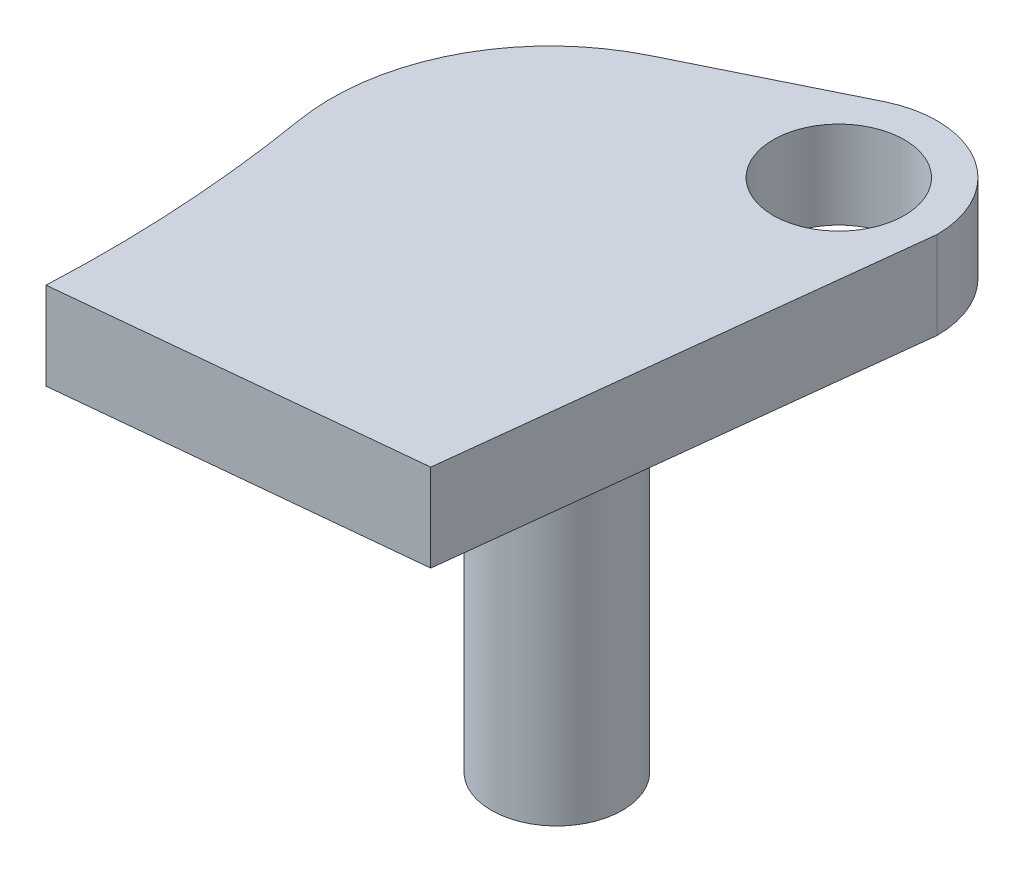
ISO-10303-21;
HEADER;
FILE_DESCRIPTION(('STEP AP214'),'2;1');
FILE_NAME('part.step','',(''),(''),'','','');
FILE_SCHEMA(('AUTOMOTIVE_DESIGN { 1 0 10303 214 1 1 1 1 }'));
ENDSEC;
DATA;
#1=APPLICATION_CONTEXT('core data for automotive mechanical design processes');
#2=APPLICATION_PROTOCOL_DEFINITION('international standard','automotive_design',2000,#1);
#3=PRODUCT_CONTEXT('',#1,'mechanical');
#4=PRODUCT('Part','Part','',(#3));
#5=PRODUCT_RELATED_PRODUCT_CATEGORY('part','',(#4));
#6=PRODUCT_DEFINITION_FORMATION('','',#4);
#7=PRODUCT_DEFINITION_CONTEXT('part definition',#1,'design');
#8=PRODUCT_DEFINITION('design','',#6,#7);
#9=PRODUCT_DEFINITION_SHAPE('','',#8);
#10=(LENGTH_UNIT() NAMED_UNIT(*) SI_UNIT(.MILLI.,.METRE.));
#11=(NAMED_UNIT(*) PLANE_ANGLE_UNIT() SI_UNIT($,.RADIAN.));
#12=(NAMED_UNIT(*) SI_UNIT($,.STERADIAN.) SOLID_ANGLE_UNIT());
#13=UNCERTAINTY_MEASURE_WITH_UNIT(LENGTH_MEASURE(1.E-05),#10,'distance_accuracy_value','');
#14=(GEOMETRIC_REPRESENTATION_CONTEXT(3) GLOBAL_UNCERTAINTY_ASSIGNED_CONTEXT((#13)) GLOBAL_UNIT_ASSIGNED_CONTEXT((#10,
#11,#12)) REPRESENTATION_CONTEXT('',''));
#15=CARTESIAN_POINT('',(0.,0.,0.));
#16=DIRECTION('',(0.,0.,1.));
#17=DIRECTION('',(1.,0.,0.));
#18=AXIS2_PLACEMENT_3D('',#15,#16,#17);
#19=CARTESIAN_POINT('',(-24.9679527722651,2.,-6.01005480013258));
#20=DIRECTION('',(0.,-1.,0.));
#21=DIRECTION('',(0.,0.,-1.));
#22=AXIS2_PLACEMENT_3D('',#19,#20,#21);
#23=CYLINDRICAL_SURFACE('',#22,28.9991720423323);
#24=CARTESIAN_POINT('',(-24.9679527722651,2.,-6.01005480013258));
#25=DIRECTION('',(0.,1.,0.));
#26=DIRECTION('',(0.,0.,1.));
#27=AXIS2_PLACEMENT_3D('',#24,#25,#26);
#28=CIRCLE('',#27,28.9991720423323);
#29=CARTESIAN_POINT('',(4.00038120431635,2.,-4.67304105224966));
#30=VERTEX_POINT('',#29);
#31=CARTESIAN_POINT('',(3.63152206259976,2.,-10.8081813418906));
#32=VERTEX_POINT('',#31);
#33=EDGE_CURVE('E94',#30,#32,#28,.T.);
#34=ORIENTED_EDGE('',*,*,#33,.T.);
#35=DIRECTION('',(0.,-1.,0.));
#36=VECTOR('',#35,1.);
#37=CARTESIAN_POINT('',(3.63152206259976,2.,-10.8081813418906));
#38=LINE('',#37,#36);
#39=CARTESIAN_POINT('',(3.63152206259976,0.,-10.8081813418906));
#40=VERTEX_POINT('',#39);
#41=EDGE_CURVE('E101',#32,#40,#38,.T.);
#42=ORIENTED_EDGE('',*,*,#41,.T.);
#43=CARTESIAN_POINT('',(-24.9679527722651,0.,-6.01005480013258));
#44=DIRECTION('',(0.,1.,0.));
#45=DIRECTION('',(0.,0.,1.));
#46=AXIS2_PLACEMENT_3D('',#43,#44,#45);
#47=CIRCLE('',#46,28.9991720423323);
#48=CARTESIAN_POINT('',(4.00038120431635,0.,-4.67304105224966));
#49=VERTEX_POINT('',#48);
#50=EDGE_CURVE('E96',#49,#40,#47,.T.);
#51=ORIENTED_EDGE('',*,*,#50,.F.);
#52=DIRECTION('',(0.,-1.,0.));
#53=VECTOR('',#52,1.);
#54=CARTESIAN_POINT('',(4.00038120431635,2.,-4.67304105224966));
#55=LINE('',#54,#53);
#56=EDGE_CURVE('E91',#30,#49,#55,.T.);
#57=ORIENTED_EDGE('',*,*,#56,.F.);
#58=EDGE_LOOP('',(#34,#42,#51,#57));
#59=FACE_BOUND('',#58,.T.);
#60=ADVANCED_FACE('F38',(#59),#23,.F.);
#61=CARTESIAN_POINT('',(-0.420916720163327,2.,-4.23344697376737));
#62=DIRECTION('',(0.0989386449958702,0.,0.995093535566572));
#63=DIRECTION('',(0.995093535566572,0.,-0.0989386449958702));
#64=AXIS2_PLACEMENT_3D('',#61,#62,#63);
#65=PLANE('',#64);
#66=DIRECTION('',(-0.995093535566572,0.,0.0989386449958702));
#67=VECTOR('',#66,1.);
#68=CARTESIAN_POINT('',(-0.420916720163327,0.,-4.23344697376737));
#69=LINE('',#68,#67);
#70=CARTESIAN_POINT('',(12.0003812043163,0.,-5.46845287202025));
#71=VERTEX_POINT('',#70);
#72=EDGE_CURVE('E128',#71,#49,#69,.T.);
#73=ORIENTED_EDGE('',*,*,#72,.F.);
#74=DIRECTION('',(0.,-1.,0.));
#75=VECTOR('',#74,1.);
#76=CARTESIAN_POINT('',(12.0003812043163,2.,-5.46845287202025));
#77=LINE('',#76,#75);
#78=CARTESIAN_POINT('',(12.0003812043163,2.,-5.46845287202025));
#79=VERTEX_POINT('',#78);
#80=EDGE_CURVE('E102',#79,#71,#77,.T.);
#81=ORIENTED_EDGE('',*,*,#80,.F.);
#82=DIRECTION('',(-0.995093535566572,0.,0.0989386449958702));
#83=VECTOR('',#82,1.);
#84=CARTESIAN_POINT('',(-0.420916720163327,2.,-4.23344697376737));
#85=LINE('',#84,#83);
#86=EDGE_CURVE('E108',#79,#30,#85,.T.);
#87=ORIENTED_EDGE('',*,*,#86,.T.);
#88=ORIENTED_EDGE('',*,*,#56,.T.);
#89=EDGE_LOOP('',(#73,#81,#87,#88));
#90=FACE_BOUND('',#89,.T.);
#91=ADVANCED_FACE('F112',(#90),#65,.T.);
#92=CARTESIAN_POINT('',(11.2330122571857,2.,1.27773804442567));
#93=DIRECTION('',(-0.993592751476446,0.,-0.113019662950595));
#94=DIRECTION('',(-0.113019662950595,0.,0.993592751476446));
#95=AXIS2_PLACEMENT_3D('',#92,#93,#94);
#96=PLANE('',#95);
#97=DIRECTION('',(0.113019662950595,0.,-0.993592751476446));
#98=VECTOR('',#97,1.);
#99=CARTESIAN_POINT('',(11.2330122571857,0.,1.27773804442567));
#100=LINE('',#99,#98);
#101=CARTESIAN_POINT('',(13.1829386551336,0.,-15.864701459756));
#102=VERTEX_POINT('',#101);
#103=EDGE_CURVE('E131',#71,#102,#100,.T.);
#104=ORIENTED_EDGE('',*,*,#103,.T.);
#105=DIRECTION('',(0.,-1.,0.));
#106=VECTOR('',#105,1.);
#107=CARTESIAN_POINT('',(13.1829386551336,2.,-15.864701459756));
#108=LINE('',#107,#106);
#109=CARTESIAN_POINT('',(13.1829386551336,2.,-15.864701459756));
#110=VERTEX_POINT('',#109);
#111=EDGE_CURVE('E141',#110,#102,#108,.T.);
#112=ORIENTED_EDGE('',*,*,#111,.F.);
#113=DIRECTION('',(0.113019662950595,0.,-0.993592751476446));
#114=VECTOR('',#113,1.);
#115=CARTESIAN_POINT('',(11.2330122571857,2.,1.27773804442567));
#116=LINE('',#115,#114);
#117=EDGE_CURVE('E114',#79,#110,#116,.T.);
#118=ORIENTED_EDGE('',*,*,#117,.F.);
#119=ORIENTED_EDGE('',*,*,#80,.T.);
#120=EDGE_LOOP('',(#104,#112,#118,#119));
#121=FACE_BOUND('',#120,.T.);
#122=ADVANCED_FACE('F153',(#121),#96,.F.);
#123=CARTESIAN_POINT('',(10.9329386551336,2.,-15.864701459756));
#124=DIRECTION('',(0.,-1.,0.));
#125=DIRECTION('',(0.,0.,-1.));
#126=AXIS2_PLACEMENT_3D('',#123,#124,#125);
#127=CYLINDRICAL_SURFACE('',#126,2.25);
#128=CARTESIAN_POINT('',(10.9329386551336,0.,-15.864701459756));
#129=DIRECTION('',(0.,1.,0.));
#130=DIRECTION('',(0.,0.,1.));
#131=AXIS2_PLACEMENT_3D('',#128,#129,#130);
#132=CIRCLE('',#131,2.25);
#133=CARTESIAN_POINT('',(9.97879512350059,0.,-17.9023741815254));
#134=VERTEX_POINT('',#133);
#135=EDGE_CURVE('E133',#102,#134,#132,.T.);
#136=ORIENTED_EDGE('',*,*,#135,.T.);
#137=DIRECTION('',(0.,-1.,0.));
#138=VECTOR('',#137,1.);
#139=CARTESIAN_POINT('',(9.97879512350059,2.,-17.9023741815254));
#140=LINE('',#139,#138);
#141=CARTESIAN_POINT('',(9.97879512350059,2.,-17.9023741815254));
#142=VERTEX_POINT('',#141);
#143=EDGE_CURVE('E126',#142,#134,#140,.T.);
#144=ORIENTED_EDGE('',*,*,#143,.F.);
#145=CARTESIAN_POINT('',(10.9329386551336,2.,-15.864701459756));
#146=DIRECTION('',(0.,1.,0.));
#147=DIRECTION('',(0.,0.,1.));
#148=AXIS2_PLACEMENT_3D('',#145,#146,#147);
#149=CIRCLE('',#148,2.25);
#150=EDGE_CURVE('E116',#110,#142,#149,.T.);
#151=ORIENTED_EDGE('',*,*,#150,.F.);
#152=ORIENTED_EDGE('',*,*,#111,.T.);
#153=EDGE_LOOP('',(#136,#144,#151,#152));
#154=FACE_BOUND('',#153,.T.);
#155=ADVANCED_FACE('F156',(#154),#127,.T.);
#156=CARTESIAN_POINT('',(-5.14512535667179,2.,-10.470819802642));
#157=DIRECTION('',(0.441011925605157,0.,0.897501243160159));
#158=DIRECTION('',(0.897501243160159,0.,-0.441011925605157));
#159=AXIS2_PLACEMENT_3D('',#156,#157,#158);
#160=PLANE('',#159);
#161=DIRECTION('',(-0.897501243160159,0.,0.441011925605157));
#162=VECTOR('',#161,1.);
#163=CARTESIAN_POINT('',(-5.14512535667179,0.,-10.470819802642));
#164=LINE('',#163,#162);
#165=CARTESIAN_POINT('',(6.3575471553922,0.,-16.1229743738036));
#166=VERTEX_POINT('',#165);
#167=EDGE_CURVE('E135',#134,#166,#164,.T.);
#168=ORIENTED_EDGE('',*,*,#167,.T.);
#169=DIRECTION('',(0.,1.,0.));
#170=VECTOR('',#169,1.);
#171=CARTESIAN_POINT('',(6.3575471553922,2.,-16.1229743738036));
#172=LINE('',#171,#170);
#173=CARTESIAN_POINT('',(6.3575471553922,2.,-16.1229743738036));
#174=VERTEX_POINT('',#173);
#175=EDGE_CURVE('E46',#166,#174,#172,.T.);
#176=ORIENTED_EDGE('',*,*,#175,.T.);
#177=DIRECTION('',(-0.897501243160159,0.,0.441011925605157));
#178=VECTOR('',#177,1.);
#179=CARTESIAN_POINT('',(-5.14512535667179,2.,-10.470819802642));
#180=LINE('',#179,#178);
#181=EDGE_CURVE('E121',#142,#174,#180,.T.);
#182=ORIENTED_EDGE('',*,*,#181,.F.);
#183=ORIENTED_EDGE('',*,*,#143,.T.);
#184=EDGE_LOOP('',(#168,#176,#182,#183));
#185=FACE_BOUND('',#184,.T.);
#186=ADVANCED_FACE('F176',(#185),#160,.F.);
#187=CARTESIAN_POINT('',(10.9329386551336,2.,-15.864701459756));
#188=DIRECTION('',(0.,-1.,0.));
#189=DIRECTION('',(0.,0.,-1.));
#190=AXIS2_PLACEMENT_3D('',#187,#188,#189);
#191=CYLINDRICAL_SURFACE('',#190,1.5);
#192=CARTESIAN_POINT('',(10.9329386551336,2.,-15.864701459756));
#193=DIRECTION('',(0.,1.,0.));
#194=DIRECTION('',(0.,0.,1.));
#195=AXIS2_PLACEMENT_3D('',#192,#193,#194);
#196=CIRCLE('',#195,1.5);
#197=CARTESIAN_POINT('',(10.9329386551336,2.,-14.364701459756));
#198=VERTEX_POINT('',#197);
#199=EDGE_CURVE('E123',#198,#198,#196,.T.);
#200=ORIENTED_EDGE('',*,*,#199,.T.);
#201=EDGE_LOOP('',(#200));
#202=FACE_BOUND('',#201,.T.);
#203=CARTESIAN_POINT('',(10.9329386551336,0.,-15.864701459756));
#204=DIRECTION('',(0.,1.,0.));
#205=DIRECTION('',(0.,0.,1.));
#206=AXIS2_PLACEMENT_3D('',#203,#204,#205);
#207=CIRCLE('',#206,1.5);
#208=CARTESIAN_POINT('',(10.9329386551336,0.,-14.364701459756));
#209=VERTEX_POINT('',#208);
#210=EDGE_CURVE('E110',#209,#209,#207,.T.);
#211=ORIENTED_EDGE('',*,*,#210,.F.);
#212=EDGE_LOOP('',(#211));
#213=FACE_BOUND('',#212,.T.);
#214=ADVANCED_FACE('F179',(#202,#213),#191,.F.);
#215=CARTESIAN_POINT('',(0.,2.,0.));
#216=DIRECTION('',(0.,1.,0.));
#217=DIRECTION('',(0.,0.,1.));
#218=AXIS2_PLACEMENT_3D('',#215,#216,#217);
#219=PLANE('',#218);
#220=ORIENTED_EDGE('',*,*,#181,.T.);
#221=CARTESIAN_POINT('',(8.56260678341798,2.,-11.6354681580028));
#222=DIRECTION('',(0.,1.,0.));
#223=DIRECTION('',(0.,0.,1.));
#224=AXIS2_PLACEMENT_3D('',#221,#222,#223);
#225=CIRCLE('',#224,5.);
#226=EDGE_CURVE('E11',#174,#32,#225,.T.);
#227=ORIENTED_EDGE('',*,*,#226,.T.);
#228=ORIENTED_EDGE('',*,*,#33,.F.);
#229=ORIENTED_EDGE('',*,*,#86,.F.);
#230=ORIENTED_EDGE('',*,*,#117,.T.);
#231=ORIENTED_EDGE('',*,*,#150,.T.);
#232=EDGE_LOOP('',(#220,#227,#228,#229,#230,#231));
#233=FACE_BOUND('',#232,.T.);
#234=ORIENTED_EDGE('',*,*,#199,.F.);
#235=EDGE_LOOP('',(#234));
#236=FACE_BOUND('',#235,.T.);
#237=ADVANCED_FACE('F106',(#233,#236),#219,.T.);
#238=CARTESIAN_POINT('',(0.,0.,0.));
#239=DIRECTION('',(0.,1.,0.));
#240=DIRECTION('',(0.,0.,1.));
#241=AXIS2_PLACEMENT_3D('',#238,#239,#240);
#242=PLANE('',#241);
#243=CARTESIAN_POINT('',(10.4875506566564,0.,-9.86470145975602));
#244=DIRECTION('',(0.,1.,0.));
#245=DIRECTION('',(0.,0.,1.));
#246=AXIS2_PLACEMENT_3D('',#243,#244,#245);
#247=CIRCLE('',#246,1.5);
#248=CARTESIAN_POINT('',(10.4875506566564,0.,-8.36470145975602));
#249=VERTEX_POINT('',#248);
#250=EDGE_CURVE('E197',#249,#249,#247,.T.);
#251=ORIENTED_EDGE('',*,*,#250,.T.);
#252=EDGE_LOOP('',(#251));
#253=FACE_BOUND('',#252,.T.);
#254=ORIENTED_EDGE('',*,*,#50,.T.);
#255=CARTESIAN_POINT('',(8.56260678341798,0.,-11.6354681580028));
#256=DIRECTION('',(0.,1.,0.));
#257=DIRECTION('',(0.,0.,1.));
#258=AXIS2_PLACEMENT_3D('',#255,#256,#257);
#259=CIRCLE('',#258,5.);
#260=EDGE_CURVE('E60',#40,#166,#259,.F.);
#261=ORIENTED_EDGE('',*,*,#260,.T.);
#262=ORIENTED_EDGE('',*,*,#167,.F.);
#263=ORIENTED_EDGE('',*,*,#135,.F.);
#264=ORIENTED_EDGE('',*,*,#103,.F.);
#265=ORIENTED_EDGE('',*,*,#72,.T.);
#266=EDGE_LOOP('',(#254,#261,#262,#263,#264,#265));
#267=FACE_BOUND('',#266,.T.);
#268=ORIENTED_EDGE('',*,*,#210,.T.);
#269=EDGE_LOOP('',(#268));
#270=FACE_BOUND('',#269,.T.);
#271=ADVANCED_FACE('F147',(#253,#267,#270),#242,.F.);
#272=CARTESIAN_POINT('',(10.4875506566564,-7.,-9.86470145975602));
#273=DIRECTION('',(0.,1.,0.));
#274=DIRECTION('',(0.,0.,1.));
#275=AXIS2_PLACEMENT_3D('',#272,#273,#274);
#276=CYLINDRICAL_SURFACE('',#275,1.5);
#277=CARTESIAN_POINT('',(10.4875506566564,-7.,-9.86470145975602));
#278=DIRECTION('',(0.,1.,0.));
#279=DIRECTION('',(0.,0.,1.));
#280=AXIS2_PLACEMENT_3D('',#277,#278,#279);
#281=CIRCLE('',#280,1.5);
#282=CARTESIAN_POINT('',(10.4875506566564,-7.,-8.36470145975602));
#283=VERTEX_POINT('',#282);
#284=EDGE_CURVE('E129',#283,#283,#281,.T.);
#285=ORIENTED_EDGE('',*,*,#284,.T.);
#286=EDGE_LOOP('',(#285));
#287=FACE_BOUND('',#286,.T.);
#288=ORIENTED_EDGE('',*,*,#250,.F.);
#289=EDGE_LOOP('',(#288));
#290=FACE_BOUND('',#289,.T.);
#291=ADVANCED_FACE('F163',(#287,#290),#276,.T.);
#292=CARTESIAN_POINT('',(10.4875506566564,-7.,-9.86470145975602));
#293=DIRECTION('',(0.,1.,0.));
#294=DIRECTION('',(0.,0.,1.));
#295=AXIS2_PLACEMENT_3D('',#292,#293,#294);
#296=PLANE('',#295);
#297=ORIENTED_EDGE('',*,*,#284,.F.);
#298=EDGE_LOOP('',(#297));
#299=FACE_BOUND('',#298,.T.);
#300=ADVANCED_FACE('F159',(#299),#296,.F.);
#301=CARTESIAN_POINT('',(8.56260678341798,2.,-11.6354681580028));
#302=DIRECTION('',(0.,-1.,0.));
#303=DIRECTION('',(0.,0.,-1.));
#304=AXIS2_PLACEMENT_3D('',#301,#302,#303);
#305=CYLINDRICAL_SURFACE('',#304,5.);
#306=ORIENTED_EDGE('',*,*,#226,.F.);
#307=ORIENTED_EDGE('',*,*,#175,.F.);
#308=ORIENTED_EDGE('',*,*,#260,.F.);
#309=ORIENTED_EDGE('',*,*,#41,.F.);
#310=EDGE_LOOP('',(#306,#307,#308,#309));
#311=FACE_BOUND('',#310,.T.);
#312=ADVANCED_FACE('F40',(#311),#305,.T.);
#313=CLOSED_SHELL('',(#60,#91,#122,#155,#186,#214,#237,#271,#291,#300,#312));
#314=MANIFOLD_SOLID_BREP('B2',#313);
#315=ADVANCED_BREP_SHAPE_REPRESENTATION('',(#18,#314),#14);
#316=SHAPE_DEFINITION_REPRESENTATION(#9,#315);
ENDSEC;
END-ISO-10303-21;
